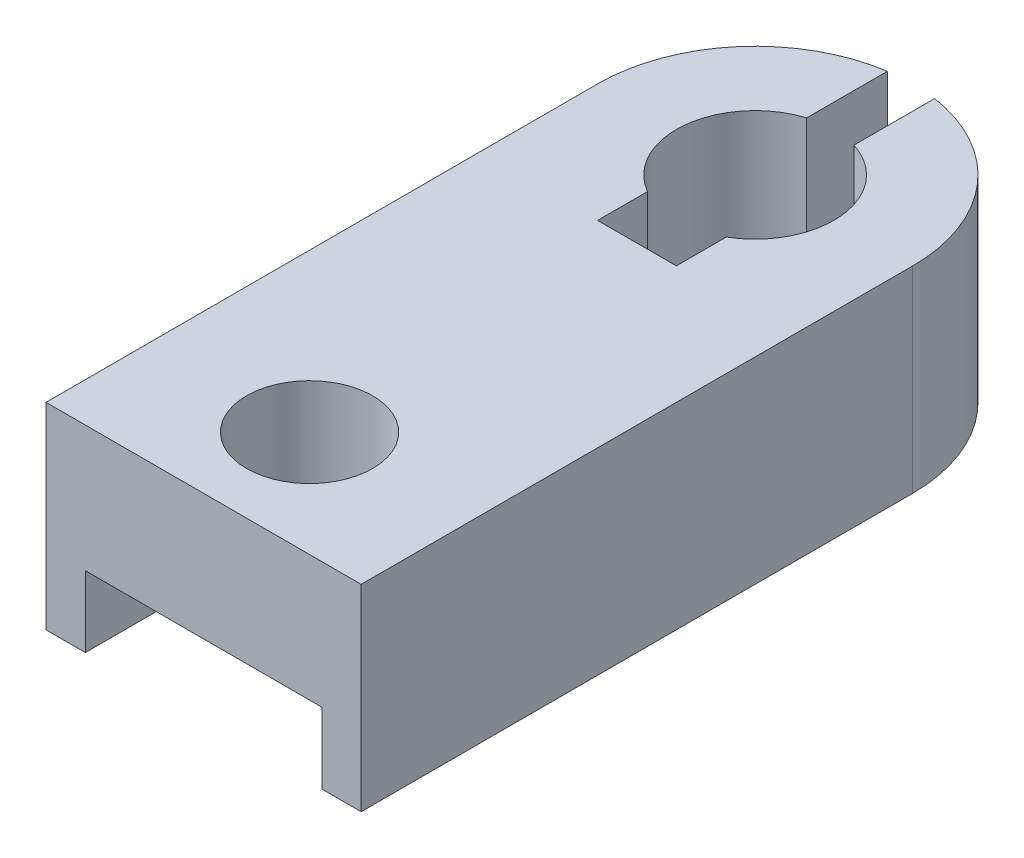
ISO-10303-21;
HEADER;
FILE_DESCRIPTION(('STEP AP214'),'2;1');
FILE_NAME('part.step','',(''),(''),'','','');
FILE_SCHEMA(('AUTOMOTIVE_DESIGN { 1 0 10303 214 1 1 1 1 }'));
ENDSEC;
DATA;
#1=APPLICATION_CONTEXT('core data for automotive mechanical design processes');
#2=APPLICATION_PROTOCOL_DEFINITION('international standard','automotive_design',2000,#1);
#3=PRODUCT_CONTEXT('',#1,'mechanical');
#4=PRODUCT('Part','Part','',(#3));
#5=PRODUCT_RELATED_PRODUCT_CATEGORY('part','',(#4));
#6=PRODUCT_DEFINITION_FORMATION('','',#4);
#7=PRODUCT_DEFINITION_CONTEXT('part definition',#1,'design');
#8=PRODUCT_DEFINITION('design','',#6,#7);
#9=PRODUCT_DEFINITION_SHAPE('','',#8);
#10=(LENGTH_UNIT() NAMED_UNIT(*) SI_UNIT(.MILLI.,.METRE.));
#11=(NAMED_UNIT(*) PLANE_ANGLE_UNIT() SI_UNIT($,.RADIAN.));
#12=(NAMED_UNIT(*) SI_UNIT($,.STERADIAN.) SOLID_ANGLE_UNIT());
#13=UNCERTAINTY_MEASURE_WITH_UNIT(LENGTH_MEASURE(1.E-05),#10,'distance_accuracy_value','');
#14=(GEOMETRIC_REPRESENTATION_CONTEXT(3) GLOBAL_UNCERTAINTY_ASSIGNED_CONTEXT((#13)) GLOBAL_UNIT_ASSIGNED_CONTEXT((#10,
#11,#12)) REPRESENTATION_CONTEXT('',''));
#15=CARTESIAN_POINT('',(0.,0.,0.));
#16=DIRECTION('',(0.,0.,1.));
#17=DIRECTION('',(1.,0.,0.));
#18=AXIS2_PLACEMENT_3D('',#15,#16,#17);
#19=CARTESIAN_POINT('',(-150.59060517228,53.6249438202247,-47.4392063556078));
#20=DIRECTION('',(0.,-1.,0.));
#21=DIRECTION('',(0.,0.,-1.));
#22=AXIS2_PLACEMENT_3D('',#19,#20,#21);
#23=CYLINDRICAL_SURFACE('',#22,20.);
#24=DIRECTION('',(0.,-1.,0.));
#25=VECTOR('',#24,1.);
#26=CARTESIAN_POINT('',(-147.59060517228,59.6249438202247,-67.2129262888929));
#27=LINE('',#26,#25);
#28=CARTESIAN_POINT('',(-147.59060517228,53.6249438202247,-67.2129262888929));
#29=VERTEX_POINT('',#28);
#30=CARTESIAN_POINT('',(-147.59060517228,28.6249438202247,-67.2129262888929));
#31=VERTEX_POINT('',#30);
#32=EDGE_CURVE('E215',#29,#31,#27,.T.);
#33=ORIENTED_EDGE('',*,*,#32,.F.);
#34=CARTESIAN_POINT('',(-150.59060517228,53.6249438202247,-47.4392063556078));
#35=DIRECTION('',(0.,1.,0.));
#36=DIRECTION('',(0.,0.,1.));
#37=AXIS2_PLACEMENT_3D('',#34,#35,#36);
#38=CIRCLE('',#37,20.);
#39=CARTESIAN_POINT('',(-130.59060517228,53.6249438202247,-47.4392063556078));
#40=VERTEX_POINT('',#39);
#41=EDGE_CURVE('E295',#40,#29,#38,.T.);
#42=ORIENTED_EDGE('',*,*,#41,.F.);
#43=DIRECTION('',(0.,-1.,0.));
#44=VECTOR('',#43,1.);
#45=CARTESIAN_POINT('',(-130.59060517228,53.6249438202247,-47.4392063556078));
#46=LINE('',#45,#44);
#47=CARTESIAN_POINT('',(-130.59060517228,28.6249438202247,-47.4392063556078));
#48=VERTEX_POINT('',#47);
#49=EDGE_CURVE('E11',#40,#48,#46,.T.);
#50=ORIENTED_EDGE('',*,*,#49,.T.);
#51=CARTESIAN_POINT('',(-150.59060517228,28.6249438202247,-47.4392063556078));
#52=DIRECTION('',(0.,1.,0.));
#53=DIRECTION('',(0.,0.,1.));
#54=AXIS2_PLACEMENT_3D('',#51,#52,#53);
#55=CIRCLE('',#54,20.);
#56=EDGE_CURVE('E311',#48,#31,#55,.T.);
#57=ORIENTED_EDGE('',*,*,#56,.T.);
#58=EDGE_LOOP('',(#33,#42,#50,#57));
#59=FACE_BOUND('',#58,.T.);
#60=ADVANCED_FACE('F47',(#59),#23,.T.);
#61=DIRECTION('',(0.,-1.,0.));
#62=VECTOR('',#61,1.);
#63=CARTESIAN_POINT('',(-153.59060517228,59.6249438202247,-67.2129262888929));
#64=LINE('',#63,#62);
#65=CARTESIAN_POINT('',(-153.59060517228,53.6249438202247,-67.2129262888929));
#66=VERTEX_POINT('',#65);
#67=CARTESIAN_POINT('',(-153.59060517228,28.6249438202247,-67.2129262888929));
#68=VERTEX_POINT('',#67);
#69=EDGE_CURVE('E172',#66,#68,#64,.T.);
#70=ORIENTED_EDGE('',*,*,#69,.T.);
#71=CARTESIAN_POINT('',(-170.59060517228,28.6249438202247,-47.4392063556078));
#72=VERTEX_POINT('',#71);
#73=EDGE_CURVE('E186',#68,#72,#55,.T.);
#74=ORIENTED_EDGE('',*,*,#73,.T.);
#75=DIRECTION('',(0.,-1.,0.));
#76=VECTOR('',#75,1.);
#77=CARTESIAN_POINT('',(-170.59060517228,53.6249438202247,-47.4392063556078));
#78=LINE('',#77,#76);
#79=CARTESIAN_POINT('',(-170.59060517228,53.6249438202247,-47.4392063556078));
#80=VERTEX_POINT('',#79);
#81=EDGE_CURVE('E56',#80,#72,#78,.T.);
#82=ORIENTED_EDGE('',*,*,#81,.F.);
#83=EDGE_CURVE('E293',#66,#80,#38,.T.);
#84=ORIENTED_EDGE('',*,*,#83,.F.);
#85=EDGE_LOOP('',(#70,#74,#82,#84));
#86=FACE_BOUND('',#85,.T.);
#87=ADVANCED_FACE('F395',(#86),#23,.T.);
#88=CARTESIAN_POINT('',(-152.9239519481,53.6249438202247,-1.99886914347495E-13));
#89=DIRECTION('',(0.,1.,0.));
#90=DIRECTION('',(0.,0.,1.));
#91=AXIS2_PLACEMENT_3D('',#88,#89,#90);
#92=PLANE('',#91);
#93=CARTESIAN_POINT('',(-150.59060517228,53.6249438202247,9.11047818298638));
#94=DIRECTION('',(0.,1.,0.));
#95=DIRECTION('',(0.,0.,1.));
#96=AXIS2_PLACEMENT_3D('',#93,#94,#95);
#97=CIRCLE('',#96,8.00000000000001);
#98=CARTESIAN_POINT('',(-150.59060517228,53.6249438202247,17.1104781829864));
#99=VERTEX_POINT('',#98);
#100=EDGE_CURVE('E248',#99,#99,#97,.T.);
#101=ORIENTED_EDGE('',*,*,#100,.F.);
#102=EDGE_LOOP('',(#101));
#103=FACE_BOUND('',#102,.T.);
#104=ORIENTED_EDGE('',*,*,#41,.T.);
#105=DIRECTION('',(0.,0.,1.));
#106=VECTOR('',#105,1.);
#107=CARTESIAN_POINT('',(-147.59060517228,53.6249438202247,-1.99886914347495E-13));
#108=LINE('',#107,#106);
#109=CARTESIAN_POINT('',(-147.59060517228,53.6249438202247,-56.9785983697772));
#110=VERTEX_POINT('',#109);
#111=EDGE_CURVE('E226',#29,#110,#108,.T.);
#112=ORIENTED_EDGE('',*,*,#111,.T.);
#113=CARTESIAN_POINT('',(-150.59060517228,53.6249438202247,-47.4392063556078));
#114=DIRECTION('',(0.,1.,0.));
#115=DIRECTION('',(0.,0.,1.));
#116=AXIS2_PLACEMENT_3D('',#113,#114,#115);
#117=CIRCLE('',#116,10.);
#118=CARTESIAN_POINT('',(-145.59060517228,53.6249438202247,-38.7789523177634));
#119=VERTEX_POINT('',#118);
#120=EDGE_CURVE('E230',#119,#110,#117,.T.);
#121=ORIENTED_EDGE('',*,*,#120,.F.);
#122=DIRECTION('',(0.,0.,1.));
#123=VECTOR('',#122,1.);
#124=CARTESIAN_POINT('',(-145.59060517228,53.6249438202247,-1.99886914347495E-13));
#125=LINE('',#124,#123);
#126=CARTESIAN_POINT('',(-145.59060517228,53.6249438202247,-32.4392063556078));
#127=VERTEX_POINT('',#126);
#128=EDGE_CURVE('E233',#119,#127,#125,.T.);
#129=ORIENTED_EDGE('',*,*,#128,.T.);
#130=DIRECTION('',(-1.,0.,0.));
#131=VECTOR('',#130,1.);
#132=CARTESIAN_POINT('',(-152.9239519481,53.6249438202247,-32.4392063556078));
#133=LINE('',#132,#131);
#134=CARTESIAN_POINT('',(-155.59060517228,53.6249438202247,-32.4392063556078));
#135=VERTEX_POINT('',#134);
#136=EDGE_CURVE('E237',#127,#135,#133,.T.);
#137=ORIENTED_EDGE('',*,*,#136,.T.);
#138=DIRECTION('',(0.,0.,1.));
#139=VECTOR('',#138,1.);
#140=CARTESIAN_POINT('',(-155.59060517228,53.6249438202247,-1.99886914347495E-13));
#141=LINE('',#140,#139);
#142=CARTESIAN_POINT('',(-155.59060517228,53.6249438202247,-38.7789523177634));
#143=VERTEX_POINT('',#142);
#144=EDGE_CURVE('E241',#143,#135,#141,.T.);
#145=ORIENTED_EDGE('',*,*,#144,.F.);
#146=CARTESIAN_POINT('',(-150.59060517228,53.6249438202247,-47.4392063556078));
#147=DIRECTION('',(0.,1.,0.));
#148=DIRECTION('',(0.,0.,1.));
#149=AXIS2_PLACEMENT_3D('',#146,#147,#148);
#150=CIRCLE('',#149,10.);
#151=CARTESIAN_POINT('',(-153.59060517228,53.6249438202247,-56.9785983697772));
#152=VERTEX_POINT('',#151);
#153=EDGE_CURVE('E205',#152,#143,#150,.T.);
#154=ORIENTED_EDGE('',*,*,#153,.F.);
#155=DIRECTION('',(0.,0.,-1.));
#156=VECTOR('',#155,1.);
#157=CARTESIAN_POINT('',(-153.59060517228,53.6249438202247,-1.99886914347495E-13));
#158=LINE('',#157,#156);
#159=EDGE_CURVE('E168',#152,#66,#158,.T.);
#160=ORIENTED_EDGE('',*,*,#159,.T.);
#161=ORIENTED_EDGE('',*,*,#83,.T.);
#162=DIRECTION('',(0.,0.,-1.));
#163=VECTOR('',#162,1.);
#164=CARTESIAN_POINT('',(-170.59060517228,53.6249438202247,-1.99886914347495E-13));
#165=LINE('',#164,#163);
#166=CARTESIAN_POINT('',(-170.59060517228,53.6249438202247,22.5607936443923));
#167=VERTEX_POINT('',#166);
#168=EDGE_CURVE('E299',#167,#80,#165,.T.);
#169=ORIENTED_EDGE('',*,*,#168,.F.);
#170=DIRECTION('',(-1.,0.,0.));
#171=VECTOR('',#170,1.);
#172=CARTESIAN_POINT('',(-152.9239519481,53.6249438202247,22.5607936443923));
#173=LINE('',#172,#171);
#174=CARTESIAN_POINT('',(-130.59060517228,53.6249438202247,22.5607936443923));
#175=VERTEX_POINT('',#174);
#176=EDGE_CURVE('E303',#175,#167,#173,.T.);
#177=ORIENTED_EDGE('',*,*,#176,.F.);
#178=DIRECTION('',(0.,0.,1.));
#179=VECTOR('',#178,1.);
#180=CARTESIAN_POINT('',(-130.59060517228,53.6249438202247,-2.03321384035026E-13));
#181=LINE('',#180,#179);
#182=EDGE_CURVE('E289',#40,#175,#181,.T.);
#183=ORIENTED_EDGE('',*,*,#182,.F.);
#184=EDGE_LOOP('',(#104,#112,#121,#129,#137,#145,#154,#160,#161,#169,#177,#183));
#185=FACE_BOUND('',#184,.T.);
#186=ADVANCED_FACE('F342',(#103,#185),#92,.T.);
#187=CARTESIAN_POINT('',(-152.9239519481,28.6249438202247,-1.99886914347495E-13));
#188=DIRECTION('',(0.,1.,0.));
#189=DIRECTION('',(0.,0.,1.));
#190=AXIS2_PLACEMENT_3D('',#187,#188,#189);
#191=PLANE('',#190);
#192=DIRECTION('',(0.,0.,-1.));
#193=VECTOR('',#192,1.);
#194=CARTESIAN_POINT('',(-147.59060517228,28.6249438202247,0.));
#195=LINE('',#194,#193);
#196=CARTESIAN_POINT('',(-147.59060517228,28.6249438202247,-56.9785983697772));
#197=VERTEX_POINT('',#196);
#198=EDGE_CURVE('E188',#197,#31,#195,.T.);
#199=ORIENTED_EDGE('',*,*,#198,.T.);
#200=ORIENTED_EDGE('',*,*,#56,.F.);
#201=DIRECTION('',(0.,0.,1.));
#202=VECTOR('',#201,1.);
#203=CARTESIAN_POINT('',(-130.59060517228,28.6249438202247,-2.03321384035026E-13));
#204=LINE('',#203,#202);
#205=CARTESIAN_POINT('',(-130.59060517228,28.6249438202247,22.5607936443923));
#206=VERTEX_POINT('',#205);
#207=EDGE_CURVE('E288',#48,#206,#204,.T.);
#208=ORIENTED_EDGE('',*,*,#207,.T.);
#209=DIRECTION('',(-1.,0.,0.));
#210=VECTOR('',#209,1.);
#211=CARTESIAN_POINT('',(-152.9239519481,28.6249438202247,22.5607936443923));
#212=LINE('',#211,#210);
#213=CARTESIAN_POINT('',(-135.59060517228,28.6249438202247,22.5607936443923));
#214=VERTEX_POINT('',#213);
#215=EDGE_CURVE('E294',#206,#214,#212,.T.);
#216=ORIENTED_EDGE('',*,*,#215,.T.);
#217=DIRECTION('',(0.,0.,-1.));
#218=VECTOR('',#217,1.);
#219=CARTESIAN_POINT('',(-135.59060517228,28.6249438202247,9.11047818298638));
#220=LINE('',#219,#218);
#221=CARTESIAN_POINT('',(-135.59060517228,28.6249438202247,9.11047818298638));
#222=VERTEX_POINT('',#221);
#223=EDGE_CURVE('E252',#214,#222,#220,.T.);
#224=ORIENTED_EDGE('',*,*,#223,.T.);
#225=CARTESIAN_POINT('',(-150.59060517228,28.6249438202247,9.11047818298638));
#226=DIRECTION('',(0.,1.,0.));
#227=DIRECTION('',(0.,0.,1.));
#228=AXIS2_PLACEMENT_3D('',#225,#226,#227);
#229=CIRCLE('',#228,15.);
#230=CARTESIAN_POINT('',(-165.59060517228,28.6249438202247,9.11047818298638));
#231=VERTEX_POINT('',#230);
#232=EDGE_CURVE('E270',#222,#231,#229,.T.);
#233=ORIENTED_EDGE('',*,*,#232,.T.);
#234=DIRECTION('',(0.,0.,1.));
#235=VECTOR('',#234,1.);
#236=CARTESIAN_POINT('',(-165.59060517228,28.6249438202247,22.5607936443923));
#237=LINE('',#236,#235);
#238=CARTESIAN_POINT('',(-165.59060517228,28.6249438202247,22.5607936443923));
#239=VERTEX_POINT('',#238);
#240=EDGE_CURVE('E258',#231,#239,#237,.T.);
#241=ORIENTED_EDGE('',*,*,#240,.T.);
#242=CARTESIAN_POINT('',(-170.59060517228,28.6249438202247,22.5607936443923));
#243=VERTEX_POINT('',#242);
#244=EDGE_CURVE('E318',#239,#243,#212,.T.);
#245=ORIENTED_EDGE('',*,*,#244,.T.);
#246=DIRECTION('',(0.,0.,-1.));
#247=VECTOR('',#246,1.);
#248=CARTESIAN_POINT('',(-170.59060517228,28.6249438202247,-1.99886914347495E-13));
#249=LINE('',#248,#247);
#250=EDGE_CURVE('E315',#243,#72,#249,.T.);
#251=ORIENTED_EDGE('',*,*,#250,.T.);
#252=ORIENTED_EDGE('',*,*,#73,.F.);
#253=DIRECTION('',(0.,0.,1.));
#254=VECTOR('',#253,1.);
#255=CARTESIAN_POINT('',(-153.59060517228,28.6249438202247,0.));
#256=LINE('',#255,#254);
#257=CARTESIAN_POINT('',(-153.59060517228,28.6249438202247,-56.9785983697772));
#258=VERTEX_POINT('',#257);
#259=EDGE_CURVE('E165',#68,#258,#256,.T.);
#260=ORIENTED_EDGE('',*,*,#259,.T.);
#261=CARTESIAN_POINT('',(-150.59060517228,28.6249438202247,-47.4392063556078));
#262=DIRECTION('',(0.,-1.,0.));
#263=DIRECTION('',(0.,0.,-1.));
#264=AXIS2_PLACEMENT_3D('',#261,#262,#263);
#265=CIRCLE('',#264,10.);
#266=CARTESIAN_POINT('',(-155.59060517228,28.6249438202247,-38.7789523177634));
#267=VERTEX_POINT('',#266);
#268=EDGE_CURVE('E176',#267,#258,#265,.T.);
#269=ORIENTED_EDGE('',*,*,#268,.F.);
#270=DIRECTION('',(0.,0.,-1.));
#271=VECTOR('',#270,1.);
#272=CARTESIAN_POINT('',(-155.59060517228,28.6249438202247,0.));
#273=LINE('',#272,#271);
#274=CARTESIAN_POINT('',(-155.59060517228,28.6249438202247,-32.4392063556078));
#275=VERTEX_POINT('',#274);
#276=EDGE_CURVE('E63',#275,#267,#273,.T.);
#277=ORIENTED_EDGE('',*,*,#276,.F.);
#278=DIRECTION('',(1.,0.,0.));
#279=VECTOR('',#278,1.);
#280=CARTESIAN_POINT('',(0.,28.6249438202247,-32.4392063556078));
#281=LINE('',#280,#279);
#282=CARTESIAN_POINT('',(-145.59060517228,28.6249438202247,-32.4392063556078));
#283=VERTEX_POINT('',#282);
#284=EDGE_CURVE('E198',#275,#283,#281,.T.);
#285=ORIENTED_EDGE('',*,*,#284,.T.);
#286=DIRECTION('',(0.,0.,-1.));
#287=VECTOR('',#286,1.);
#288=CARTESIAN_POINT('',(-145.59060517228,28.6249438202247,0.));
#289=LINE('',#288,#287);
#290=CARTESIAN_POINT('',(-145.59060517228,28.6249438202247,-38.7789523177634));
#291=VERTEX_POINT('',#290);
#292=EDGE_CURVE('E194',#283,#291,#289,.T.);
#293=ORIENTED_EDGE('',*,*,#292,.T.);
#294=EDGE_CURVE('E181',#197,#291,#265,.T.);
#295=ORIENTED_EDGE('',*,*,#294,.F.);
#296=EDGE_LOOP('',(#199,#200,#208,#216,#224,#233,#241,#245,#251,#252,#260,#269,#277,#285,#293,#295));
#297=FACE_BOUND('',#296,.T.);
#298=ADVANCED_FACE('F184',(#297),#191,.F.);
#299=CARTESIAN_POINT('',(-152.9239519481,53.6249438202247,22.5607936443923));
#300=DIRECTION('',(0.,0.,1.));
#301=DIRECTION('',(1.,0.,0.));
#302=AXIS2_PLACEMENT_3D('',#299,#300,#301);
#303=PLANE('',#302);
#304=DIRECTION('',(1.,0.,0.));
#305=VECTOR('',#304,1.);
#306=CARTESIAN_POINT('',(-165.59060517228,37.6249438202247,22.5607936443923));
#307=LINE('',#306,#305);
#308=CARTESIAN_POINT('',(-165.59060517228,37.6249438202247,22.5607936443923));
#309=VERTEX_POINT('',#308);
#310=CARTESIAN_POINT('',(-135.59060517228,37.6249438202247,22.5607936443923));
#311=VERTEX_POINT('',#310);
#312=EDGE_CURVE('E253',#309,#311,#307,.T.);
#313=ORIENTED_EDGE('',*,*,#312,.T.);
#314=DIRECTION('',(0.,-1.,0.));
#315=VECTOR('',#314,1.);
#316=CARTESIAN_POINT('',(-135.59060517228,37.6249438202247,22.5607936443923));
#317=LINE('',#316,#315);
#318=EDGE_CURVE('E284',#311,#214,#317,.T.);
#319=ORIENTED_EDGE('',*,*,#318,.T.);
#320=ORIENTED_EDGE('',*,*,#215,.F.);
#321=DIRECTION('',(0.,-1.,0.));
#322=VECTOR('',#321,1.);
#323=CARTESIAN_POINT('',(-130.59060517228,53.6249438202247,22.5607936443923));
#324=LINE('',#323,#322);
#325=EDGE_CURVE('E307',#175,#206,#324,.T.);
#326=ORIENTED_EDGE('',*,*,#325,.F.);
#327=ORIENTED_EDGE('',*,*,#176,.T.);
#328=DIRECTION('',(0.,-1.,0.));
#329=VECTOR('',#328,1.);
#330=CARTESIAN_POINT('',(-170.59060517228,53.6249438202247,22.5607936443923));
#331=LINE('',#330,#329);
#332=EDGE_CURVE('E324',#167,#243,#331,.T.);
#333=ORIENTED_EDGE('',*,*,#332,.T.);
#334=ORIENTED_EDGE('',*,*,#244,.F.);
#335=DIRECTION('',(0.,-1.,0.));
#336=VECTOR('',#335,1.);
#337=CARTESIAN_POINT('',(-165.59060517228,37.6249438202247,22.5607936443923));
#338=LINE('',#337,#336);
#339=EDGE_CURVE('E71',#309,#239,#338,.T.);
#340=ORIENTED_EDGE('',*,*,#339,.F.);
#341=EDGE_LOOP('',(#313,#319,#320,#326,#327,#333,#334,#340));
#342=FACE_BOUND('',#341,.T.);
#343=ADVANCED_FACE('F339',(#342),#303,.T.);
#344=CARTESIAN_POINT('',(-130.59060517228,53.6249438202247,-2.03321384035026E-13));
#345=DIRECTION('',(1.,0.,0.));
#346=DIRECTION('',(0.,0.,-1.));
#347=AXIS2_PLACEMENT_3D('',#344,#345,#346);
#348=PLANE('',#347);
#349=ORIENTED_EDGE('',*,*,#207,.F.);
#350=ORIENTED_EDGE('',*,*,#49,.F.);
#351=ORIENTED_EDGE('',*,*,#182,.T.);
#352=ORIENTED_EDGE('',*,*,#325,.T.);
#353=EDGE_LOOP('',(#349,#350,#351,#352));
#354=FACE_BOUND('',#353,.T.);
#355=ADVANCED_FACE('F49',(#354),#348,.T.);
#356=CARTESIAN_POINT('',(-170.59060517228,53.6249438202247,-1.99886914347495E-13));
#357=DIRECTION('',(-1.,0.,0.));
#358=DIRECTION('',(0.,0.,1.));
#359=AXIS2_PLACEMENT_3D('',#356,#357,#358);
#360=PLANE('',#359);
#361=ORIENTED_EDGE('',*,*,#250,.F.);
#362=ORIENTED_EDGE('',*,*,#332,.F.);
#363=ORIENTED_EDGE('',*,*,#168,.T.);
#364=ORIENTED_EDGE('',*,*,#81,.T.);
#365=EDGE_LOOP('',(#361,#362,#363,#364));
#366=FACE_BOUND('',#365,.T.);
#367=ADVANCED_FACE('F332',(#366),#360,.T.);
#368=CARTESIAN_POINT('',(-150.59060517228,37.6249438202247,9.11047818298638));
#369=DIRECTION('',(0.,1.,0.));
#370=DIRECTION('',(0.,0.,1.));
#371=AXIS2_PLACEMENT_3D('',#368,#369,#370);
#372=PLANE('',#371);
#373=ORIENTED_EDGE('',*,*,#312,.F.);
#374=DIRECTION('',(0.,0.,1.));
#375=VECTOR('',#374,1.);
#376=CARTESIAN_POINT('',(-165.59060517228,37.6249438202247,22.5607936443923));
#377=LINE('',#376,#375);
#378=CARTESIAN_POINT('',(-165.59060517228,37.6249438202247,9.11047818298638));
#379=VERTEX_POINT('',#378);
#380=EDGE_CURVE('E264',#379,#309,#377,.T.);
#381=ORIENTED_EDGE('',*,*,#380,.F.);
#382=CARTESIAN_POINT('',(-150.59060517228,37.6249438202247,9.11047818298638));
#383=DIRECTION('',(0.,1.,0.));
#384=DIRECTION('',(0.,0.,1.));
#385=AXIS2_PLACEMENT_3D('',#382,#383,#384);
#386=CIRCLE('',#385,15.);
#387=CARTESIAN_POINT('',(-135.59060517228,37.6249438202247,9.11047818298638));
#388=VERTEX_POINT('',#387);
#389=EDGE_CURVE('E261',#388,#379,#386,.T.);
#390=ORIENTED_EDGE('',*,*,#389,.F.);
#391=DIRECTION('',(0.,0.,-1.));
#392=VECTOR('',#391,1.);
#393=CARTESIAN_POINT('',(-135.59060517228,37.6249438202247,9.11047818298638));
#394=LINE('',#393,#392);
#395=EDGE_CURVE('E257',#311,#388,#394,.T.);
#396=ORIENTED_EDGE('',*,*,#395,.F.);
#397=EDGE_LOOP('',(#373,#381,#390,#396));
#398=FACE_BOUND('',#397,.T.);
#399=CARTESIAN_POINT('',(-150.59060517228,37.6249438202247,9.11047818298638));
#400=DIRECTION('',(0.,1.,0.));
#401=DIRECTION('',(0.,0.,1.));
#402=AXIS2_PLACEMENT_3D('',#399,#400,#401);
#403=CIRCLE('',#402,8.00000000000001);
#404=CARTESIAN_POINT('',(-150.59060517228,37.6249438202247,17.1104781829864));
#405=VERTEX_POINT('',#404);
#406=EDGE_CURVE('E244',#405,#405,#403,.T.);
#407=ORIENTED_EDGE('',*,*,#406,.T.);
#408=EDGE_LOOP('',(#407));
#409=FACE_BOUND('',#408,.T.);
#410=ADVANCED_FACE('F402',(#398,#409),#372,.F.);
#411=CARTESIAN_POINT('',(-135.59060517228,37.6249438202247,9.11047818298638));
#412=DIRECTION('',(-1.,0.,0.));
#413=DIRECTION('',(0.,0.,1.));
#414=AXIS2_PLACEMENT_3D('',#411,#412,#413);
#415=PLANE('',#414);
#416=ORIENTED_EDGE('',*,*,#223,.F.);
#417=ORIENTED_EDGE('',*,*,#318,.F.);
#418=ORIENTED_EDGE('',*,*,#395,.T.);
#419=DIRECTION('',(0.,-1.,0.));
#420=VECTOR('',#419,1.);
#421=CARTESIAN_POINT('',(-135.59060517228,37.6249438202247,9.11047818298638));
#422=LINE('',#421,#420);
#423=EDGE_CURVE('E281',#388,#222,#422,.T.);
#424=ORIENTED_EDGE('',*,*,#423,.T.);
#425=EDGE_LOOP('',(#416,#417,#418,#424));
#426=FACE_BOUND('',#425,.T.);
#427=ADVANCED_FACE('F373',(#426),#415,.T.);
#428=CARTESIAN_POINT('',(-150.59060517228,37.6249438202247,9.11047818298638));
#429=DIRECTION('',(0.,-1.,0.));
#430=DIRECTION('',(0.,0.,-1.));
#431=AXIS2_PLACEMENT_3D('',#428,#429,#430);
#432=CYLINDRICAL_SURFACE('',#431,15.);
#433=ORIENTED_EDGE('',*,*,#232,.F.);
#434=ORIENTED_EDGE('',*,*,#423,.F.);
#435=ORIENTED_EDGE('',*,*,#389,.T.);
#436=DIRECTION('',(0.,-1.,0.));
#437=VECTOR('',#436,1.);
#438=CARTESIAN_POINT('',(-165.59060517228,37.6249438202247,9.11047818298638));
#439=LINE('',#438,#437);
#440=EDGE_CURVE('E278',#379,#231,#439,.T.);
#441=ORIENTED_EDGE('',*,*,#440,.T.);
#442=EDGE_LOOP('',(#433,#434,#435,#441));
#443=FACE_BOUND('',#442,.T.);
#444=ADVANCED_FACE('F377',(#443),#432,.F.);
#445=CARTESIAN_POINT('',(-165.59060517228,37.6249438202247,22.5607936443923));
#446=DIRECTION('',(1.,0.,0.));
#447=DIRECTION('',(0.,0.,-1.));
#448=AXIS2_PLACEMENT_3D('',#445,#446,#447);
#449=PLANE('',#448);
#450=ORIENTED_EDGE('',*,*,#240,.F.);
#451=ORIENTED_EDGE('',*,*,#440,.F.);
#452=ORIENTED_EDGE('',*,*,#380,.T.);
#453=ORIENTED_EDGE('',*,*,#339,.T.);
#454=EDGE_LOOP('',(#450,#451,#452,#453));
#455=FACE_BOUND('',#454,.T.);
#456=ADVANCED_FACE('F381',(#455),#449,.T.);
#457=CARTESIAN_POINT('',(-150.59060517228,59.6249438202247,9.11047818298638));
#458=DIRECTION('',(0.,-1.,0.));
#459=DIRECTION('',(0.,0.,-1.));
#460=AXIS2_PLACEMENT_3D('',#457,#458,#459);
#461=CYLINDRICAL_SURFACE('',#460,8.00000000000001);
#462=ORIENTED_EDGE('',*,*,#100,.T.);
#463=EDGE_LOOP('',(#462));
#464=FACE_BOUND('',#463,.T.);
#465=ORIENTED_EDGE('',*,*,#406,.F.);
#466=EDGE_LOOP('',(#465));
#467=FACE_BOUND('',#466,.T.);
#468=ADVANCED_FACE('F383',(#464,#467),#461,.F.);
#469=CARTESIAN_POINT('',(-155.59060517228,59.6249438202247,0.));
#470=DIRECTION('',(-1.,0.,0.));
#471=DIRECTION('',(0.,0.,1.));
#472=AXIS2_PLACEMENT_3D('',#469,#470,#471);
#473=PLANE('',#472);
#474=ORIENTED_EDGE('',*,*,#144,.T.);
#475=DIRECTION('',(0.,-1.,0.));
#476=VECTOR('',#475,1.);
#477=CARTESIAN_POINT('',(-155.59060517228,59.6249438202247,-32.4392063556078));
#478=LINE('',#477,#476);
#479=EDGE_CURVE('E202',#135,#275,#478,.T.);
#480=ORIENTED_EDGE('',*,*,#479,.T.);
#481=ORIENTED_EDGE('',*,*,#276,.T.);
#482=DIRECTION('',(0.,-1.,0.));
#483=VECTOR('',#482,1.);
#484=CARTESIAN_POINT('',(-155.59060517228,59.6249438202247,-38.7789523177634));
#485=LINE('',#484,#483);
#486=EDGE_CURVE('E173',#143,#267,#485,.T.);
#487=ORIENTED_EDGE('',*,*,#486,.F.);
#488=EDGE_LOOP('',(#474,#480,#481,#487));
#489=FACE_BOUND('',#488,.T.);
#490=ADVANCED_FACE('F389',(#489),#473,.F.);
#491=CARTESIAN_POINT('',(0.,59.6249438202247,-32.4392063556078));
#492=DIRECTION('',(0.,0.,-1.));
#493=DIRECTION('',(-1.,0.,0.));
#494=AXIS2_PLACEMENT_3D('',#491,#492,#493);
#495=PLANE('',#494);
#496=DIRECTION('',(0.,-1.,0.));
#497=VECTOR('',#496,1.);
#498=CARTESIAN_POINT('',(-145.59060517228,59.6249438202247,-32.4392063556078));
#499=LINE('',#498,#497);
#500=EDGE_CURVE('E206',#127,#283,#499,.T.);
#501=ORIENTED_EDGE('',*,*,#500,.T.);
#502=ORIENTED_EDGE('',*,*,#284,.F.);
#503=ORIENTED_EDGE('',*,*,#479,.F.);
#504=ORIENTED_EDGE('',*,*,#136,.F.);
#505=EDGE_LOOP('',(#501,#502,#503,#504));
#506=FACE_BOUND('',#505,.T.);
#507=ADVANCED_FACE('F421',(#506),#495,.T.);
#508=CARTESIAN_POINT('',(-145.59060517228,59.6249438202247,0.));
#509=DIRECTION('',(-1.,0.,0.));
#510=DIRECTION('',(0.,0.,1.));
#511=AXIS2_PLACEMENT_3D('',#508,#509,#510);
#512=PLANE('',#511);
#513=DIRECTION('',(0.,-1.,0.));
#514=VECTOR('',#513,1.);
#515=CARTESIAN_POINT('',(-145.59060517228,59.6249438202247,-38.7789523177634));
#516=LINE('',#515,#514);
#517=EDGE_CURVE('E209',#119,#291,#516,.T.);
#518=ORIENTED_EDGE('',*,*,#517,.T.);
#519=ORIENTED_EDGE('',*,*,#292,.F.);
#520=ORIENTED_EDGE('',*,*,#500,.F.);
#521=ORIENTED_EDGE('',*,*,#128,.F.);
#522=EDGE_LOOP('',(#518,#519,#520,#521));
#523=FACE_BOUND('',#522,.T.);
#524=ADVANCED_FACE('F359',(#523),#512,.T.);
#525=CARTESIAN_POINT('',(-150.59060517228,59.6249438202247,-47.4392063556078));
#526=DIRECTION('',(0.,-1.,0.));
#527=DIRECTION('',(0.,0.,-1.));
#528=AXIS2_PLACEMENT_3D('',#525,#526,#527);
#529=CYLINDRICAL_SURFACE('',#528,10.);
#530=ORIENTED_EDGE('',*,*,#120,.T.);
#531=DIRECTION('',(0.,-1.,0.));
#532=VECTOR('',#531,1.);
#533=CARTESIAN_POINT('',(-147.59060517228,59.6249438202247,-56.9785983697772));
#534=LINE('',#533,#532);
#535=EDGE_CURVE('E212',#110,#197,#534,.T.);
#536=ORIENTED_EDGE('',*,*,#535,.T.);
#537=ORIENTED_EDGE('',*,*,#294,.T.);
#538=ORIENTED_EDGE('',*,*,#517,.F.);
#539=EDGE_LOOP('',(#530,#536,#537,#538));
#540=FACE_BOUND('',#539,.T.);
#541=ADVANCED_FACE('F351',(#540),#529,.F.);
#542=CARTESIAN_POINT('',(-147.59060517228,59.6249438202247,0.));
#543=DIRECTION('',(-1.,0.,0.));
#544=DIRECTION('',(0.,0.,1.));
#545=AXIS2_PLACEMENT_3D('',#542,#543,#544);
#546=PLANE('',#545);
#547=ORIENTED_EDGE('',*,*,#32,.T.);
#548=ORIENTED_EDGE('',*,*,#198,.F.);
#549=ORIENTED_EDGE('',*,*,#535,.F.);
#550=ORIENTED_EDGE('',*,*,#111,.F.);
#551=EDGE_LOOP('',(#547,#548,#549,#550));
#552=FACE_BOUND('',#551,.T.);
#553=ADVANCED_FACE('F362',(#552),#546,.T.);
#554=CARTESIAN_POINT('',(-153.59060517228,59.6249438202247,0.));
#555=DIRECTION('',(1.,0.,0.));
#556=DIRECTION('',(0.,0.,-1.));
#557=AXIS2_PLACEMENT_3D('',#554,#555,#556);
#558=PLANE('',#557);
#559=DIRECTION('',(0.,-1.,0.));
#560=VECTOR('',#559,1.);
#561=CARTESIAN_POINT('',(-153.59060517228,59.6249438202247,-56.9785983697772));
#562=LINE('',#561,#560);
#563=EDGE_CURVE('E161',#152,#258,#562,.T.);
#564=ORIENTED_EDGE('',*,*,#563,.T.);
#565=ORIENTED_EDGE('',*,*,#259,.F.);
#566=ORIENTED_EDGE('',*,*,#69,.F.);
#567=ORIENTED_EDGE('',*,*,#159,.F.);
#568=EDGE_LOOP('',(#564,#565,#566,#567));
#569=FACE_BOUND('',#568,.T.);
#570=ADVANCED_FACE('F163',(#569),#558,.T.);
#571=ORIENTED_EDGE('',*,*,#153,.T.);
#572=ORIENTED_EDGE('',*,*,#486,.T.);
#573=ORIENTED_EDGE('',*,*,#268,.T.);
#574=ORIENTED_EDGE('',*,*,#563,.F.);
#575=EDGE_LOOP('',(#571,#572,#573,#574));
#576=FACE_BOUND('',#575,.T.);
#577=ADVANCED_FACE('F177',(#576),#529,.F.);
#578=CLOSED_SHELL('',(#60,#87,#186,#298,#343,#355,#367,#410,#427,#444,#456,#468,#490,#507,#524,
#541,#553,#570,#577));
#579=MANIFOLD_SOLID_BREP('B2',#578);
#580=ADVANCED_BREP_SHAPE_REPRESENTATION('',(#18,#579),#14);
#581=SHAPE_DEFINITION_REPRESENTATION(#9,#580);
ENDSEC;
END-ISO-10303-21;
